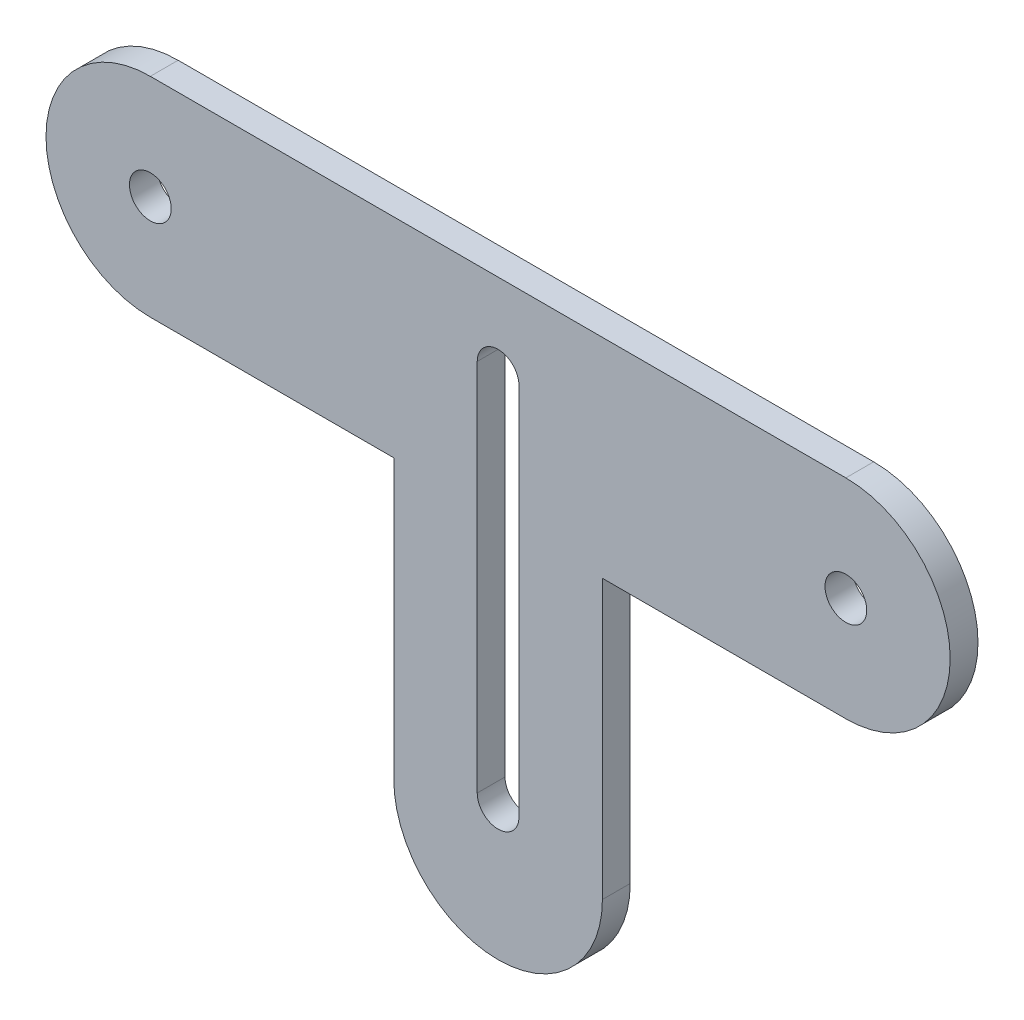
ISO-10303-21;
HEADER;
FILE_DESCRIPTION(('STEP AP214'),'2;1');
FILE_NAME('part.step','',(''),(''),'','','');
FILE_SCHEMA(('AUTOMOTIVE_DESIGN { 1 0 10303 214 1 1 1 1 }'));
ENDSEC;
DATA;
#1=APPLICATION_CONTEXT('core data for automotive mechanical design processes');
#2=APPLICATION_PROTOCOL_DEFINITION('international standard','automotive_design',2000,#1);
#3=PRODUCT_CONTEXT('',#1,'mechanical');
#4=PRODUCT('Part','Part','',(#3));
#5=PRODUCT_RELATED_PRODUCT_CATEGORY('part','',(#4));
#6=PRODUCT_DEFINITION_FORMATION('','',#4);
#7=PRODUCT_DEFINITION_CONTEXT('part definition',#1,'design');
#8=PRODUCT_DEFINITION('design','',#6,#7);
#9=PRODUCT_DEFINITION_SHAPE('','',#8);
#10=(LENGTH_UNIT() NAMED_UNIT(*) SI_UNIT(.MILLI.,.METRE.));
#11=(NAMED_UNIT(*) PLANE_ANGLE_UNIT() SI_UNIT($,.RADIAN.));
#12=(NAMED_UNIT(*) SI_UNIT($,.STERADIAN.) SOLID_ANGLE_UNIT());
#13=UNCERTAINTY_MEASURE_WITH_UNIT(LENGTH_MEASURE(1.E-05),#10,'distance_accuracy_value','');
#14=(GEOMETRIC_REPRESENTATION_CONTEXT(3) GLOBAL_UNCERTAINTY_ASSIGNED_CONTEXT((#13)) GLOBAL_UNIT_ASSIGNED_CONTEXT((#10,
#11,#12)) REPRESENTATION_CONTEXT('',''));
#15=CARTESIAN_POINT('',(0.,0.,0.));
#16=DIRECTION('',(0.,0.,1.));
#17=DIRECTION('',(1.,0.,0.));
#18=AXIS2_PLACEMENT_3D('',#15,#16,#17);
#19=CARTESIAN_POINT('',(-35.2442860666362,-5.26701592750134,2.));
#20=DIRECTION('',(0.,0.,-1.));
#21=DIRECTION('',(-1.,0.,0.));
#22=AXIS2_PLACEMENT_3D('',#19,#20,#21);
#23=CYLINDRICAL_SURFACE('',#22,7.50000000000002);
#24=CARTESIAN_POINT('',(-35.2442860666362,-5.26701592750134,0.));
#25=DIRECTION('',(0.,0.,1.));
#26=DIRECTION('',(1.,0.,0.));
#27=AXIS2_PLACEMENT_3D('',#24,#25,#26);
#28=CIRCLE('',#27,7.50000000000002);
#29=CARTESIAN_POINT('',(-35.2442860666362,2.23298407249867,0.));
#30=VERTEX_POINT('',#29);
#31=CARTESIAN_POINT('',(-35.2442854554797,-12.7670159275013,0.));
#32=VERTEX_POINT('',#31);
#33=EDGE_CURVE('E158',#30,#32,#28,.T.);
#34=ORIENTED_EDGE('',*,*,#33,.T.);
#35=DIRECTION('',(0.,0.,-1.));
#36=VECTOR('',#35,1.);
#37=CARTESIAN_POINT('',(-35.2442854554797,-12.7670159275013,2.));
#38=LINE('',#37,#36);
#39=CARTESIAN_POINT('',(-35.2442854554797,-12.7670159275013,2.));
#40=VERTEX_POINT('',#39);
#41=EDGE_CURVE('E11',#40,#32,#38,.T.);
#42=ORIENTED_EDGE('',*,*,#41,.F.);
#43=CARTESIAN_POINT('',(-35.2442860666362,-5.26701592750134,2.));
#44=DIRECTION('',(0.,0.,1.));
#45=DIRECTION('',(1.,0.,0.));
#46=AXIS2_PLACEMENT_3D('',#43,#44,#45);
#47=CIRCLE('',#46,7.50000000000002);
#48=CARTESIAN_POINT('',(-35.2442860666362,2.23298407249867,2.));
#49=VERTEX_POINT('',#48);
#50=EDGE_CURVE('E162',#49,#40,#47,.T.);
#51=ORIENTED_EDGE('',*,*,#50,.F.);
#52=DIRECTION('',(0.,0.,-1.));
#53=VECTOR('',#52,1.);
#54=CARTESIAN_POINT('',(-35.2442860666362,2.23298407249867,2.));
#55=LINE('',#54,#53);
#56=EDGE_CURVE('E180',#49,#30,#55,.T.);
#57=ORIENTED_EDGE('',*,*,#56,.T.);
#58=EDGE_LOOP('',(#34,#42,#51,#57));
#59=FACE_BOUND('',#58,.T.);
#60=ADVANCED_FACE('F33',(#59),#23,.T.);
#61=CARTESIAN_POINT('',(-35.2442854554797,-12.7670159275013,2.));
#62=DIRECTION('',(0.,1.,0.));
#63=DIRECTION('',(0.,0.,1.));
#64=AXIS2_PLACEMENT_3D('',#61,#62,#63);
#65=PLANE('',#64);
#66=DIRECTION('',(1.,0.,0.));
#67=VECTOR('',#66,1.);
#68=CARTESIAN_POINT('',(-35.2442854554797,-12.7670159275013,0.));
#69=LINE('',#68,#67);
#70=CARTESIAN_POINT('',(-17.7442854554797,-12.7670159275013,0.));
#71=VERTEX_POINT('',#70);
#72=EDGE_CURVE('E183',#32,#71,#69,.T.);
#73=ORIENTED_EDGE('',*,*,#72,.T.);
#74=DIRECTION('',(0.,0.,-1.));
#75=VECTOR('',#74,1.);
#76=CARTESIAN_POINT('',(-17.7442854554797,-12.7670159275013,2.));
#77=LINE('',#76,#75);
#78=CARTESIAN_POINT('',(-17.7442854554797,-12.7670159275013,2.));
#79=VERTEX_POINT('',#78);
#80=EDGE_CURVE('E40',#79,#71,#77,.T.);
#81=ORIENTED_EDGE('',*,*,#80,.F.);
#82=DIRECTION('',(1.,0.,0.));
#83=VECTOR('',#82,1.);
#84=CARTESIAN_POINT('',(-35.2442854554797,-12.7670159275013,2.));
#85=LINE('',#84,#83);
#86=EDGE_CURVE('E165',#40,#79,#85,.T.);
#87=ORIENTED_EDGE('',*,*,#86,.F.);
#88=ORIENTED_EDGE('',*,*,#41,.T.);
#89=EDGE_LOOP('',(#73,#81,#87,#88));
#90=FACE_BOUND('',#89,.T.);
#91=ADVANCED_FACE('F238',(#90),#65,.F.);
#92=CARTESIAN_POINT('',(-17.7442854554797,-12.7670159275013,2.));
#93=DIRECTION('',(1.,0.,0.));
#94=DIRECTION('',(0.,0.,-1.));
#95=AXIS2_PLACEMENT_3D('',#92,#93,#94);
#96=PLANE('',#95);
#97=DIRECTION('',(0.,-1.,0.));
#98=VECTOR('',#97,1.);
#99=CARTESIAN_POINT('',(-17.7442854554797,-12.7670159275013,0.));
#100=LINE('',#99,#98);
#101=CARTESIAN_POINT('',(-17.7442854554797,-32.7670159275013,0.));
#102=VERTEX_POINT('',#101);
#103=EDGE_CURVE('E185',#71,#102,#100,.T.);
#104=ORIENTED_EDGE('',*,*,#103,.T.);
#105=DIRECTION('',(0.,0.,-1.));
#106=VECTOR('',#105,1.);
#107=CARTESIAN_POINT('',(-17.7442854554797,-32.7670159275013,2.));
#108=LINE('',#107,#106);
#109=CARTESIAN_POINT('',(-17.7442854554797,-32.7670159275013,2.));
#110=VERTEX_POINT('',#109);
#111=EDGE_CURVE('E210',#110,#102,#108,.T.);
#112=ORIENTED_EDGE('',*,*,#111,.F.);
#113=DIRECTION('',(0.,-1.,0.));
#114=VECTOR('',#113,1.);
#115=CARTESIAN_POINT('',(-17.7442854554797,-12.7670159275013,2.));
#116=LINE('',#115,#114);
#117=EDGE_CURVE('E168',#79,#110,#116,.T.);
#118=ORIENTED_EDGE('',*,*,#117,.F.);
#119=ORIENTED_EDGE('',*,*,#80,.T.);
#120=EDGE_LOOP('',(#104,#112,#118,#119));
#121=FACE_BOUND('',#120,.T.);
#122=ADVANCED_FACE('F217',(#121),#96,.F.);
#123=CARTESIAN_POINT('',(-10.244286560658,-32.7670159275013,2.));
#124=DIRECTION('',(0.,0.,-1.));
#125=DIRECTION('',(-1.,0.,0.));
#126=AXIS2_PLACEMENT_3D('',#123,#124,#125);
#127=CYLINDRICAL_SURFACE('',#126,7.49999889482169);
#128=CARTESIAN_POINT('',(-10.244286560658,-32.7670159275013,0.));
#129=DIRECTION('',(0.,0.,1.));
#130=DIRECTION('',(-1.,0.,0.));
#131=AXIS2_PLACEMENT_3D('',#128,#129,#130);
#132=CIRCLE('',#131,7.49999889482169);
#133=CARTESIAN_POINT('',(-2.74428766583636,-32.7670159275013,0.));
#134=VERTEX_POINT('',#133);
#135=EDGE_CURVE('E187',#102,#134,#132,.T.);
#136=ORIENTED_EDGE('',*,*,#135,.T.);
#137=DIRECTION('',(0.,0.,-1.));
#138=VECTOR('',#137,1.);
#139=CARTESIAN_POINT('',(-2.74428766583636,-32.7670159275013,2.));
#140=LINE('',#139,#138);
#141=CARTESIAN_POINT('',(-2.74428766583636,-32.7670159275013,2.));
#142=VERTEX_POINT('',#141);
#143=EDGE_CURVE('E207',#142,#134,#140,.T.);
#144=ORIENTED_EDGE('',*,*,#143,.F.);
#145=CARTESIAN_POINT('',(-10.244286560658,-32.7670159275013,2.));
#146=DIRECTION('',(0.,0.,1.));
#147=DIRECTION('',(-1.,0.,0.));
#148=AXIS2_PLACEMENT_3D('',#145,#146,#147);
#149=CIRCLE('',#148,7.49999889482169);
#150=EDGE_CURVE('E170',#110,#142,#149,.T.);
#151=ORIENTED_EDGE('',*,*,#150,.F.);
#152=ORIENTED_EDGE('',*,*,#111,.T.);
#153=EDGE_LOOP('',(#136,#144,#151,#152));
#154=FACE_BOUND('',#153,.T.);
#155=ADVANCED_FACE('F226',(#154),#127,.T.);
#156=CARTESIAN_POINT('',(-2.74428766583636,-12.7670159275013,2.));
#157=DIRECTION('',(-1.,0.,0.));
#158=DIRECTION('',(0.,-1.,0.));
#159=AXIS2_PLACEMENT_3D('',#156,#157,#158);
#160=PLANE('',#159);
#161=DIRECTION('',(0.,1.,0.));
#162=VECTOR('',#161,1.);
#163=CARTESIAN_POINT('',(-2.74428766583636,-12.7670159275013,0.));
#164=LINE('',#163,#162);
#165=CARTESIAN_POINT('',(-2.74428766583636,-12.7670159275013,0.));
#166=VERTEX_POINT('',#165);
#167=EDGE_CURVE('E189',#134,#166,#164,.T.);
#168=ORIENTED_EDGE('',*,*,#167,.T.);
#169=DIRECTION('',(0.,0.,-1.));
#170=VECTOR('',#169,1.);
#171=CARTESIAN_POINT('',(-2.74428766583636,-12.7670159275013,2.));
#172=LINE('',#171,#170);
#173=CARTESIAN_POINT('',(-2.74428766583636,-12.7670159275013,2.));
#174=VERTEX_POINT('',#173);
#175=EDGE_CURVE('E204',#174,#166,#172,.T.);
#176=ORIENTED_EDGE('',*,*,#175,.F.);
#177=DIRECTION('',(0.,1.,0.));
#178=VECTOR('',#177,1.);
#179=CARTESIAN_POINT('',(-2.74428766583636,-12.7670159275013,2.));
#180=LINE('',#179,#178);
#181=EDGE_CURVE('E172',#142,#174,#180,.T.);
#182=ORIENTED_EDGE('',*,*,#181,.F.);
#183=ORIENTED_EDGE('',*,*,#143,.T.);
#184=EDGE_LOOP('',(#168,#176,#182,#183));
#185=FACE_BOUND('',#184,.T.);
#186=ADVANCED_FACE('F230',(#185),#160,.F.);
#187=CARTESIAN_POINT('',(14.7557123341636,-12.7670159275013,2.));
#188=DIRECTION('',(0.,1.,0.));
#189=DIRECTION('',(0.,0.,1.));
#190=AXIS2_PLACEMENT_3D('',#187,#188,#189);
#191=PLANE('',#190);
#192=DIRECTION('',(1.,0.,0.));
#193=VECTOR('',#192,1.);
#194=CARTESIAN_POINT('',(14.7557123341636,-12.7670159275013,0.));
#195=LINE('',#194,#193);
#196=CARTESIAN_POINT('',(14.7557123341636,-12.7670159275013,0.));
#197=VERTEX_POINT('',#196);
#198=EDGE_CURVE('E191',#166,#197,#195,.T.);
#199=ORIENTED_EDGE('',*,*,#198,.T.);
#200=DIRECTION('',(0.,0.,-1.));
#201=VECTOR('',#200,1.);
#202=CARTESIAN_POINT('',(14.7557123341636,-12.7670159275013,2.));
#203=LINE('',#202,#201);
#204=CARTESIAN_POINT('',(14.7557123341636,-12.7670159275013,2.));
#205=VERTEX_POINT('',#204);
#206=EDGE_CURVE('E201',#205,#197,#203,.T.);
#207=ORIENTED_EDGE('',*,*,#206,.F.);
#208=DIRECTION('',(1.,0.,0.));
#209=VECTOR('',#208,1.);
#210=CARTESIAN_POINT('',(14.7557123341636,-12.7670159275013,2.));
#211=LINE('',#210,#209);
#212=EDGE_CURVE('E174',#174,#205,#211,.T.);
#213=ORIENTED_EDGE('',*,*,#212,.F.);
#214=ORIENTED_EDGE('',*,*,#175,.T.);
#215=EDGE_LOOP('',(#199,#207,#213,#214));
#216=FACE_BOUND('',#215,.T.);
#217=ADVANCED_FACE('F251',(#216),#191,.F.);
#218=CARTESIAN_POINT('',(14.7557131337637,-5.26701592750133,2.));
#219=DIRECTION('',(0.,0.,-1.));
#220=DIRECTION('',(-1.,0.,0.));
#221=AXIS2_PLACEMENT_3D('',#218,#219,#220);
#222=CYLINDRICAL_SURFACE('',#221,7.50000000000004);
#223=CARTESIAN_POINT('',(14.7557131337637,-5.26701592750133,0.));
#224=DIRECTION('',(0.,0.,1.));
#225=DIRECTION('',(-1.,0.,0.));
#226=AXIS2_PLACEMENT_3D('',#223,#224,#225);
#227=CIRCLE('',#226,7.50000000000004);
#228=CARTESIAN_POINT('',(14.7557139333638,2.23298407249867,0.));
#229=VERTEX_POINT('',#228);
#230=EDGE_CURVE('E193',#197,#229,#227,.T.);
#231=ORIENTED_EDGE('',*,*,#230,.T.);
#232=DIRECTION('',(0.,0.,-1.));
#233=VECTOR('',#232,1.);
#234=CARTESIAN_POINT('',(14.7557139333638,2.23298407249867,2.));
#235=LINE('',#234,#233);
#236=CARTESIAN_POINT('',(14.7557139333638,2.23298407249867,2.));
#237=VERTEX_POINT('',#236);
#238=EDGE_CURVE('E198',#237,#229,#235,.T.);
#239=ORIENTED_EDGE('',*,*,#238,.F.);
#240=CARTESIAN_POINT('',(14.7557131337637,-5.26701592750133,2.));
#241=DIRECTION('',(0.,0.,1.));
#242=DIRECTION('',(-1.,0.,0.));
#243=AXIS2_PLACEMENT_3D('',#240,#241,#242);
#244=CIRCLE('',#243,7.50000000000004);
#245=EDGE_CURVE('E176',#205,#237,#244,.T.);
#246=ORIENTED_EDGE('',*,*,#245,.F.);
#247=ORIENTED_EDGE('',*,*,#206,.T.);
#248=EDGE_LOOP('',(#231,#239,#246,#247));
#249=FACE_BOUND('',#248,.T.);
#250=ADVANCED_FACE('F249',(#249),#222,.T.);
#251=CARTESIAN_POINT('',(-35.2442860666362,2.23298407249867,2.));
#252=DIRECTION('',(0.,-1.,0.));
#253=DIRECTION('',(1.,0.,0.));
#254=AXIS2_PLACEMENT_3D('',#251,#252,#253);
#255=PLANE('',#254);
#256=DIRECTION('',(-1.,0.,0.));
#257=VECTOR('',#256,1.);
#258=CARTESIAN_POINT('',(-35.2442860666362,2.23298407249867,0.));
#259=LINE('',#258,#257);
#260=EDGE_CURVE('E166',#229,#30,#259,.T.);
#261=ORIENTED_EDGE('',*,*,#260,.T.);
#262=ORIENTED_EDGE('',*,*,#56,.F.);
#263=DIRECTION('',(-1.,0.,0.));
#264=VECTOR('',#263,1.);
#265=CARTESIAN_POINT('',(-35.2442860666362,2.23298407249867,2.));
#266=LINE('',#265,#264);
#267=EDGE_CURVE('E178',#237,#49,#266,.T.);
#268=ORIENTED_EDGE('',*,*,#267,.F.);
#269=ORIENTED_EDGE('',*,*,#238,.T.);
#270=EDGE_LOOP('',(#261,#262,#268,#269));
#271=FACE_BOUND('',#270,.T.);
#272=ADVANCED_FACE('F244',(#271),#255,.F.);
#273=CARTESIAN_POINT('',(-35.2442860666362,-5.26701592750134,2.));
#274=DIRECTION('',(0.,0.,1.));
#275=DIRECTION('',(1.,0.,0.));
#276=AXIS2_PLACEMENT_3D('',#273,#274,#275);
#277=PLANE('',#276);
#278=CARTESIAN_POINT('',(14.7557123341636,-5.26701592750133,2.));
#279=DIRECTION('',(0.,0.,-1.));
#280=DIRECTION('',(-1.,0.,0.));
#281=AXIS2_PLACEMENT_3D('',#278,#279,#280);
#282=CIRCLE('',#281,1.5);
#283=CARTESIAN_POINT('',(13.2557123341636,-5.26701592750133,2.));
#284=VERTEX_POINT('',#283);
#285=EDGE_CURVE('E152',#284,#284,#282,.T.);
#286=ORIENTED_EDGE('',*,*,#285,.T.);
#287=EDGE_LOOP('',(#286));
#288=FACE_BOUND('',#287,.T.);
#289=CARTESIAN_POINT('',(-35.2442854554797,-5.26701592750133,2.));
#290=DIRECTION('',(0.,0.,-1.));
#291=DIRECTION('',(-1.,0.,0.));
#292=AXIS2_PLACEMENT_3D('',#289,#290,#291);
#293=CIRCLE('',#292,1.5);
#294=CARTESIAN_POINT('',(-36.7442854554797,-5.26701592750133,2.));
#295=VERTEX_POINT('',#294);
#296=EDGE_CURVE('E379',#295,#295,#293,.T.);
#297=ORIENTED_EDGE('',*,*,#296,.T.);
#298=EDGE_LOOP('',(#297));
#299=FACE_BOUND('',#298,.T.);
#300=CARTESIAN_POINT('',(-10.244286560658,-3.76701592750133,2.));
#301=DIRECTION('',(0.,0.,1.));
#302=DIRECTION('',(-1.,0.,0.));
#303=AXIS2_PLACEMENT_3D('',#300,#301,#302);
#304=CIRCLE('',#303,1.49999889482169);
#305=CARTESIAN_POINT('',(-8.74428766583635,-3.76701592750133,2.));
#306=VERTEX_POINT('',#305);
#307=CARTESIAN_POINT('',(-11.7442854554797,-3.76701592750133,2.));
#308=VERTEX_POINT('',#307);
#309=EDGE_CURVE('E47',#306,#308,#304,.T.);
#310=ORIENTED_EDGE('',*,*,#309,.F.);
#311=DIRECTION('',(0.,1.,0.));
#312=VECTOR('',#311,1.);
#313=CARTESIAN_POINT('',(-8.74428766583635,-3.76701592750133,2.));
#314=LINE('',#313,#312);
#315=CARTESIAN_POINT('',(-8.74428766583635,-30.6354352777873,2.));
#316=VERTEX_POINT('',#315);
#317=EDGE_CURVE('E139',#316,#306,#314,.T.);
#318=ORIENTED_EDGE('',*,*,#317,.F.);
#319=CARTESIAN_POINT('',(-10.244286560658,-30.6354352777873,2.));
#320=DIRECTION('',(0.,0.,1.));
#321=DIRECTION('',(-1.,0.,0.));
#322=AXIS2_PLACEMENT_3D('',#319,#320,#321);
#323=CIRCLE('',#322,1.49999889482169);
#324=CARTESIAN_POINT('',(-11.7442854554797,-30.6354352777873,2.));
#325=VERTEX_POINT('',#324);
#326=EDGE_CURVE('E142',#325,#316,#323,.T.);
#327=ORIENTED_EDGE('',*,*,#326,.F.);
#328=DIRECTION('',(0.,-1.,0.));
#329=VECTOR('',#328,1.);
#330=CARTESIAN_POINT('',(-11.7442854554797,-3.76701592750133,2.));
#331=LINE('',#330,#329);
#332=EDGE_CURVE('E151',#308,#325,#331,.T.);
#333=ORIENTED_EDGE('',*,*,#332,.F.);
#334=EDGE_LOOP('',(#310,#318,#327,#333));
#335=FACE_BOUND('',#334,.T.);
#336=ORIENTED_EDGE('',*,*,#50,.T.);
#337=ORIENTED_EDGE('',*,*,#86,.T.);
#338=ORIENTED_EDGE('',*,*,#117,.T.);
#339=ORIENTED_EDGE('',*,*,#150,.T.);
#340=ORIENTED_EDGE('',*,*,#181,.T.);
#341=ORIENTED_EDGE('',*,*,#212,.T.);
#342=ORIENTED_EDGE('',*,*,#245,.T.);
#343=ORIENTED_EDGE('',*,*,#267,.T.);
#344=EDGE_LOOP('',(#336,#337,#338,#339,#340,#341,#342,#343));
#345=FACE_BOUND('',#344,.T.);
#346=ADVANCED_FACE('F234',(#288,#299,#335,#345),#277,.T.);
#347=CARTESIAN_POINT('',(-35.2442860666362,-5.26701592750134,0.));
#348=DIRECTION('',(0.,0.,1.));
#349=DIRECTION('',(1.,0.,0.));
#350=AXIS2_PLACEMENT_3D('',#347,#348,#349);
#351=PLANE('',#350);
#352=CARTESIAN_POINT('',(14.7557123341636,-5.26701592750133,0.));
#353=DIRECTION('',(0.,0.,-1.));
#354=DIRECTION('',(-1.,0.,0.));
#355=AXIS2_PLACEMENT_3D('',#352,#353,#354);
#356=CIRCLE('',#355,1.5);
#357=CARTESIAN_POINT('',(13.2557123341636,-5.26701592750133,0.));
#358=VERTEX_POINT('',#357);
#359=EDGE_CURVE('E378',#358,#358,#356,.T.);
#360=ORIENTED_EDGE('',*,*,#359,.F.);
#361=EDGE_LOOP('',(#360));
#362=FACE_BOUND('',#361,.T.);
#363=CARTESIAN_POINT('',(-35.2442854554797,-5.26701592750133,0.));
#364=DIRECTION('',(0.,0.,-1.));
#365=DIRECTION('',(-1.,0.,0.));
#366=AXIS2_PLACEMENT_3D('',#363,#364,#365);
#367=CIRCLE('',#366,1.5);
#368=CARTESIAN_POINT('',(-36.7442854554797,-5.26701592750133,0.));
#369=VERTEX_POINT('',#368);
#370=EDGE_CURVE('E145',#369,#369,#367,.T.);
#371=ORIENTED_EDGE('',*,*,#370,.F.);
#372=EDGE_LOOP('',(#371));
#373=FACE_BOUND('',#372,.T.);
#374=DIRECTION('',(0.,1.,0.));
#375=VECTOR('',#374,1.);
#376=CARTESIAN_POINT('',(-8.74428766583635,-3.76701592750133,0.));
#377=LINE('',#376,#375);
#378=CARTESIAN_POINT('',(-8.74428766583635,-30.6354352777873,0.));
#379=VERTEX_POINT('',#378);
#380=CARTESIAN_POINT('',(-8.74428766583635,-3.76701592750133,0.));
#381=VERTEX_POINT('',#380);
#382=EDGE_CURVE('E129',#379,#381,#377,.T.);
#383=ORIENTED_EDGE('',*,*,#382,.T.);
#384=CARTESIAN_POINT('',(-10.244286560658,-3.76701592750133,0.));
#385=DIRECTION('',(0.,0.,1.));
#386=DIRECTION('',(-1.,0.,0.));
#387=AXIS2_PLACEMENT_3D('',#384,#385,#386);
#388=CIRCLE('',#387,1.49999889482169);
#389=CARTESIAN_POINT('',(-11.7442854554797,-3.76701592750133,0.));
#390=VERTEX_POINT('',#389);
#391=EDGE_CURVE('E123',#381,#390,#388,.T.);
#392=ORIENTED_EDGE('',*,*,#391,.T.);
#393=DIRECTION('',(0.,-1.,0.));
#394=VECTOR('',#393,1.);
#395=CARTESIAN_POINT('',(-11.7442854554797,-3.76701592750133,0.));
#396=LINE('',#395,#394);
#397=CARTESIAN_POINT('',(-11.7442854554797,-30.6354352777873,0.));
#398=VERTEX_POINT('',#397);
#399=EDGE_CURVE('E132',#390,#398,#396,.T.);
#400=ORIENTED_EDGE('',*,*,#399,.T.);
#401=CARTESIAN_POINT('',(-10.244286560658,-30.6354352777873,0.));
#402=DIRECTION('',(0.,0.,1.));
#403=DIRECTION('',(-1.,0.,0.));
#404=AXIS2_PLACEMENT_3D('',#401,#402,#403);
#405=CIRCLE('',#404,1.49999889482169);
#406=EDGE_CURVE('E55',#398,#379,#405,.T.);
#407=ORIENTED_EDGE('',*,*,#406,.T.);
#408=EDGE_LOOP('',(#383,#392,#400,#407));
#409=FACE_BOUND('',#408,.T.);
#410=ORIENTED_EDGE('',*,*,#33,.F.);
#411=ORIENTED_EDGE('',*,*,#260,.F.);
#412=ORIENTED_EDGE('',*,*,#230,.F.);
#413=ORIENTED_EDGE('',*,*,#198,.F.);
#414=ORIENTED_EDGE('',*,*,#167,.F.);
#415=ORIENTED_EDGE('',*,*,#135,.F.);
#416=ORIENTED_EDGE('',*,*,#103,.F.);
#417=ORIENTED_EDGE('',*,*,#72,.F.);
#418=EDGE_LOOP('',(#410,#411,#412,#413,#414,#415,#416,#417));
#419=FACE_BOUND('',#418,.T.);
#420=ADVANCED_FACE('F136',(#362,#373,#409,#419),#351,.F.);
#421=CARTESIAN_POINT('',(-10.244286560658,-3.76701592750133,0.));
#422=DIRECTION('',(0.,0.,1.));
#423=DIRECTION('',(1.,0.,0.));
#424=AXIS2_PLACEMENT_3D('',#421,#422,#423);
#425=CYLINDRICAL_SURFACE('',#424,1.49999889482169);
#426=ORIENTED_EDGE('',*,*,#309,.T.);
#427=DIRECTION('',(0.,0.,1.));
#428=VECTOR('',#427,1.);
#429=CARTESIAN_POINT('',(-11.7442854554797,-3.76701592750133,0.));
#430=LINE('',#429,#428);
#431=EDGE_CURVE('E119',#390,#308,#430,.T.);
#432=ORIENTED_EDGE('',*,*,#431,.F.);
#433=ORIENTED_EDGE('',*,*,#391,.F.);
#434=DIRECTION('',(0.,0.,1.));
#435=VECTOR('',#434,1.);
#436=CARTESIAN_POINT('',(-8.74428766583635,-3.76701592750133,0.));
#437=LINE('',#436,#435);
#438=EDGE_CURVE('E156',#381,#306,#437,.T.);
#439=ORIENTED_EDGE('',*,*,#438,.T.);
#440=EDGE_LOOP('',(#426,#432,#433,#439));
#441=FACE_BOUND('',#440,.T.);
#442=ADVANCED_FACE('F121',(#441),#425,.F.);
#443=CARTESIAN_POINT('',(-8.74428766583635,-3.76701592750133,0.));
#444=DIRECTION('',(1.,0.,0.));
#445=DIRECTION('',(0.,0.,-1.));
#446=AXIS2_PLACEMENT_3D('',#443,#444,#445);
#447=PLANE('',#446);
#448=ORIENTED_EDGE('',*,*,#317,.T.);
#449=ORIENTED_EDGE('',*,*,#438,.F.);
#450=ORIENTED_EDGE('',*,*,#382,.F.);
#451=DIRECTION('',(0.,0.,1.));
#452=VECTOR('',#451,1.);
#453=CARTESIAN_POINT('',(-8.74428766583635,-30.6354352777873,0.));
#454=LINE('',#453,#452);
#455=EDGE_CURVE('E159',#379,#316,#454,.T.);
#456=ORIENTED_EDGE('',*,*,#455,.T.);
#457=EDGE_LOOP('',(#448,#449,#450,#456));
#458=FACE_BOUND('',#457,.T.);
#459=ADVANCED_FACE('F307',(#458),#447,.F.);
#460=CARTESIAN_POINT('',(-10.244286560658,-30.6354352777873,0.));
#461=DIRECTION('',(0.,0.,1.));
#462=DIRECTION('',(1.,0.,0.));
#463=AXIS2_PLACEMENT_3D('',#460,#461,#462);
#464=CYLINDRICAL_SURFACE('',#463,1.49999889482169);
#465=ORIENTED_EDGE('',*,*,#326,.T.);
#466=ORIENTED_EDGE('',*,*,#455,.F.);
#467=ORIENTED_EDGE('',*,*,#406,.F.);
#468=DIRECTION('',(0.,0.,1.));
#469=VECTOR('',#468,1.);
#470=CARTESIAN_POINT('',(-11.7442854554797,-30.6354352777873,0.));
#471=LINE('',#470,#469);
#472=EDGE_CURVE('E128',#398,#325,#471,.T.);
#473=ORIENTED_EDGE('',*,*,#472,.T.);
#474=EDGE_LOOP('',(#465,#466,#467,#473));
#475=FACE_BOUND('',#474,.T.);
#476=ADVANCED_FACE('F318',(#475),#464,.F.);
#477=CARTESIAN_POINT('',(-11.7442854554797,-3.76701592750133,0.));
#478=DIRECTION('',(-1.,0.,0.));
#479=DIRECTION('',(0.,0.,1.));
#480=AXIS2_PLACEMENT_3D('',#477,#478,#479);
#481=PLANE('',#480);
#482=ORIENTED_EDGE('',*,*,#332,.T.);
#483=ORIENTED_EDGE('',*,*,#472,.F.);
#484=ORIENTED_EDGE('',*,*,#399,.F.);
#485=ORIENTED_EDGE('',*,*,#431,.T.);
#486=EDGE_LOOP('',(#482,#483,#484,#485));
#487=FACE_BOUND('',#486,.T.);
#488=ADVANCED_FACE('F133',(#487),#481,.F.);
#489=CARTESIAN_POINT('',(-35.2442854554797,-5.26701592750133,2.));
#490=DIRECTION('',(0.,0.,-1.));
#491=DIRECTION('',(-1.,0.,0.));
#492=AXIS2_PLACEMENT_3D('',#489,#490,#491);
#493=CYLINDRICAL_SURFACE('',#492,1.5);
#494=ORIENTED_EDGE('',*,*,#296,.F.);
#495=EDGE_LOOP('',(#494));
#496=FACE_BOUND('',#495,.T.);
#497=ORIENTED_EDGE('',*,*,#370,.T.);
#498=EDGE_LOOP('',(#497));
#499=FACE_BOUND('',#498,.T.);
#500=ADVANCED_FACE('F336',(#496,#499),#493,.F.);
#501=CARTESIAN_POINT('',(14.7557123341636,-5.26701592750133,2.));
#502=DIRECTION('',(0.,0.,-1.));
#503=DIRECTION('',(-1.,0.,0.));
#504=AXIS2_PLACEMENT_3D('',#501,#502,#503);
#505=CYLINDRICAL_SURFACE('',#504,1.5);
#506=ORIENTED_EDGE('',*,*,#285,.F.);
#507=EDGE_LOOP('',(#506));
#508=FACE_BOUND('',#507,.T.);
#509=ORIENTED_EDGE('',*,*,#359,.T.);
#510=EDGE_LOOP('',(#509));
#511=FACE_BOUND('',#510,.T.);
#512=ADVANCED_FACE('F359',(#508,#511),#505,.F.);
#513=CLOSED_SHELL('',(#60,#91,#122,#155,#186,#217,#250,#272,#346,#420,#442,#459,#476,#488,#500,#512));
#514=MANIFOLD_SOLID_BREP('B2',#513);
#515=ADVANCED_BREP_SHAPE_REPRESENTATION('',(#18,#514),#14);
#516=SHAPE_DEFINITION_REPRESENTATION(#9,#515);
ENDSEC;
END-ISO-10303-21;
